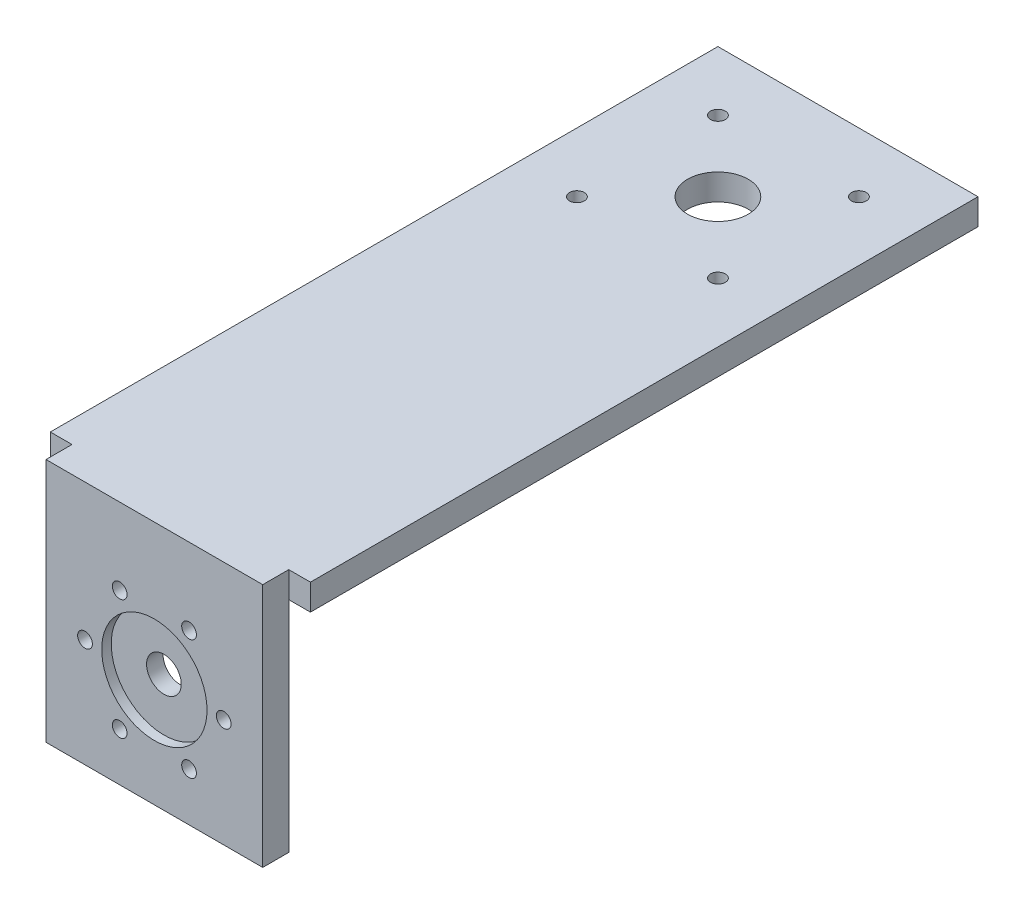
ISO-10303-21;
HEADER;
FILE_DESCRIPTION(('STEP AP214'),'2;1');
FILE_NAME('part.step','',(''),(''),'','','');
FILE_SCHEMA(('AUTOMOTIVE_DESIGN { 1 0 10303 214 1 1 1 1 }'));
ENDSEC;
DATA;
#1=APPLICATION_CONTEXT('core data for automotive mechanical design processes');
#2=APPLICATION_PROTOCOL_DEFINITION('international standard','automotive_design',2000,#1);
#3=PRODUCT_CONTEXT('',#1,'mechanical');
#4=PRODUCT('Part','Part','',(#3));
#5=PRODUCT_RELATED_PRODUCT_CATEGORY('part','',(#4));
#6=PRODUCT_DEFINITION_FORMATION('','',#4);
#7=PRODUCT_DEFINITION_CONTEXT('part definition',#1,'design');
#8=PRODUCT_DEFINITION('design','',#6,#7);
#9=PRODUCT_DEFINITION_SHAPE('','',#8);
#10=(LENGTH_UNIT() NAMED_UNIT(*) SI_UNIT(.MILLI.,.METRE.));
#11=(NAMED_UNIT(*) PLANE_ANGLE_UNIT() SI_UNIT($,.RADIAN.));
#12=(NAMED_UNIT(*) SI_UNIT($,.STERADIAN.) SOLID_ANGLE_UNIT());
#13=UNCERTAINTY_MEASURE_WITH_UNIT(LENGTH_MEASURE(1.E-05),#10,'distance_accuracy_value','');
#14=(GEOMETRIC_REPRESENTATION_CONTEXT(3) GLOBAL_UNCERTAINTY_ASSIGNED_CONTEXT((#13)) GLOBAL_UNIT_ASSIGNED_CONTEXT((#10,
#11,#12)) REPRESENTATION_CONTEXT('',''));
#15=CARTESIAN_POINT('',(0.,0.,0.));
#16=DIRECTION('',(0.,0.,1.));
#17=DIRECTION('',(1.,0.,0.));
#18=AXIS2_PLACEMENT_3D('',#15,#16,#17);
#19=CARTESIAN_POINT('',(0.,0.,-6.));
#20=DIRECTION('',(0.,0.,-1.));
#21=DIRECTION('',(-1.,0.,0.));
#22=AXIS2_PLACEMENT_3D('',#19,#20,#21);
#23=PLANE('',#22);
#24=CARTESIAN_POINT('',(8.,13.856406460551,-6.));
#25=DIRECTION('',(0.,0.,1.));
#26=DIRECTION('',(1.,0.,0.));
#27=AXIS2_PLACEMENT_3D('',#24,#25,#26);
#28=CIRCLE('',#27,1.7);
#29=CARTESIAN_POINT('',(9.7,13.856406460551,-6.));
#30=VERTEX_POINT('',#29);
#31=EDGE_CURVE('E167',#30,#30,#28,.T.);
#32=ORIENTED_EDGE('',*,*,#31,.T.);
#33=EDGE_LOOP('',(#32));
#34=FACE_BOUND('',#33,.T.);
#35=CARTESIAN_POINT('',(-16.,0.,-6.));
#36=DIRECTION('',(0.,0.,1.));
#37=DIRECTION('',(1.,0.,0.));
#38=AXIS2_PLACEMENT_3D('',#35,#36,#37);
#39=CIRCLE('',#38,1.7);
#40=CARTESIAN_POINT('',(-14.3,0.,-6.));
#41=VERTEX_POINT('',#40);
#42=EDGE_CURVE('E177',#41,#41,#39,.T.);
#43=ORIENTED_EDGE('',*,*,#42,.T.);
#44=EDGE_LOOP('',(#43));
#45=FACE_BOUND('',#44,.T.);
#46=CARTESIAN_POINT('',(8.,-13.856406460551,-6.));
#47=DIRECTION('',(0.,0.,1.));
#48=DIRECTION('',(1.,0.,0.));
#49=AXIS2_PLACEMENT_3D('',#46,#47,#48);
#50=CIRCLE('',#49,1.7);
#51=CARTESIAN_POINT('',(9.7,-13.856406460551,-6.));
#52=VERTEX_POINT('',#51);
#53=EDGE_CURVE('E190',#52,#52,#50,.T.);
#54=ORIENTED_EDGE('',*,*,#53,.T.);
#55=EDGE_LOOP('',(#54));
#56=FACE_BOUND('',#55,.T.);
#57=CARTESIAN_POINT('',(16.,0.,-6.));
#58=DIRECTION('',(0.,0.,1.));
#59=DIRECTION('',(1.,0.,0.));
#60=AXIS2_PLACEMENT_3D('',#57,#58,#59);
#61=CIRCLE('',#60,1.7);
#62=CARTESIAN_POINT('',(17.7,0.,-6.));
#63=VERTEX_POINT('',#62);
#64=EDGE_CURVE('E191',#63,#63,#61,.T.);
#65=ORIENTED_EDGE('',*,*,#64,.T.);
#66=EDGE_LOOP('',(#65));
#67=FACE_BOUND('',#66,.T.);
#68=CARTESIAN_POINT('',(-8.,-13.856406460551,-6.));
#69=DIRECTION('',(0.,0.,1.));
#70=DIRECTION('',(1.,0.,0.));
#71=AXIS2_PLACEMENT_3D('',#68,#69,#70);
#72=CIRCLE('',#71,1.7);
#73=CARTESIAN_POINT('',(-6.3,-13.856406460551,-6.));
#74=VERTEX_POINT('',#73);
#75=EDGE_CURVE('E185',#74,#74,#72,.T.);
#76=ORIENTED_EDGE('',*,*,#75,.T.);
#77=EDGE_LOOP('',(#76));
#78=FACE_BOUND('',#77,.T.);
#79=CARTESIAN_POINT('',(-8.00000000000001,13.856406460551,-6.));
#80=DIRECTION('',(0.,0.,1.));
#81=DIRECTION('',(1.,0.,0.));
#82=AXIS2_PLACEMENT_3D('',#79,#80,#81);
#83=CIRCLE('',#82,1.7);
#84=CARTESIAN_POINT('',(-6.30000000000001,13.856406460551,-6.));
#85=VERTEX_POINT('',#84);
#86=EDGE_CURVE('E168',#85,#85,#83,.T.);
#87=ORIENTED_EDGE('',*,*,#86,.T.);
#88=EDGE_LOOP('',(#87));
#89=FACE_BOUND('',#88,.T.);
#90=CARTESIAN_POINT('',(0.,0.,-6.));
#91=DIRECTION('',(0.,0.,1.));
#92=DIRECTION('',(1.,0.,0.));
#93=AXIS2_PLACEMENT_3D('',#90,#91,#92);
#94=CIRCLE('',#93,4.);
#95=CARTESIAN_POINT('',(4.,0.,-6.));
#96=VERTEX_POINT('',#95);
#97=EDGE_CURVE('E162',#96,#96,#94,.T.);
#98=ORIENTED_EDGE('',*,*,#97,.T.);
#99=EDGE_LOOP('',(#98));
#100=FACE_BOUND('',#99,.T.);
#101=DIRECTION('',(0.,-1.,0.));
#102=VECTOR('',#101,1.);
#103=CARTESIAN_POINT('',(-25.,-25.,-6.));
#104=LINE('',#103,#102);
#105=CARTESIAN_POINT('',(-25.,25.5,-6.));
#106=VERTEX_POINT('',#105);
#107=CARTESIAN_POINT('',(-25.,-25.,-6.));
#108=VERTEX_POINT('',#107);
#109=EDGE_CURVE('E199',#106,#108,#104,.T.);
#110=ORIENTED_EDGE('',*,*,#109,.F.);
#111=DIRECTION('',(1.,0.,0.));
#112=VECTOR('',#111,1.);
#113=CARTESIAN_POINT('',(-30.,25.5,-6.));
#114=LINE('',#113,#112);
#115=CARTESIAN_POINT('',(25.,25.5,-6.));
#116=VERTEX_POINT('',#115);
#117=EDGE_CURVE('E11',#106,#116,#114,.T.);
#118=ORIENTED_EDGE('',*,*,#117,.T.);
#119=DIRECTION('',(0.,1.,0.));
#120=VECTOR('',#119,1.);
#121=CARTESIAN_POINT('',(25.,31.5,-6.));
#122=LINE('',#121,#120);
#123=CARTESIAN_POINT('',(25.,-25.,-6.));
#124=VERTEX_POINT('',#123);
#125=EDGE_CURVE('E202',#124,#116,#122,.T.);
#126=ORIENTED_EDGE('',*,*,#125,.F.);
#127=DIRECTION('',(1.,0.,0.));
#128=VECTOR('',#127,1.);
#129=CARTESIAN_POINT('',(25.,-25.,-6.));
#130=LINE('',#129,#128);
#131=EDGE_CURVE('E85',#108,#124,#130,.T.);
#132=ORIENTED_EDGE('',*,*,#131,.F.);
#133=EDGE_LOOP('',(#110,#118,#126,#132));
#134=FACE_BOUND('',#133,.T.);
#135=ADVANCED_FACE('F39',(#34,#45,#56,#67,#78,#89,#100,#134),#23,.T.);
#136=CARTESIAN_POINT('',(0.,0.,0.));
#137=DIRECTION('',(0.,0.,-1.));
#138=DIRECTION('',(-1.,0.,0.));
#139=AXIS2_PLACEMENT_3D('',#136,#137,#138);
#140=CYLINDRICAL_SURFACE('',#139,4.);
#141=ORIENTED_EDGE('',*,*,#97,.F.);
#142=EDGE_LOOP('',(#141));
#143=FACE_BOUND('',#142,.T.);
#144=CARTESIAN_POINT('',(0.,0.,-2.2));
#145=DIRECTION('',(0.,0.,1.));
#146=DIRECTION('',(1.,0.,0.));
#147=AXIS2_PLACEMENT_3D('',#144,#145,#146);
#148=CIRCLE('',#147,4.);
#149=CARTESIAN_POINT('',(4.,0.,-2.2));
#150=VERTEX_POINT('',#149);
#151=EDGE_CURVE('E43',#150,#150,#148,.T.);
#152=ORIENTED_EDGE('',*,*,#151,.T.);
#153=EDGE_LOOP('',(#152));
#154=FACE_BOUND('',#153,.T.);
#155=ADVANCED_FACE('F233',(#143,#154),#140,.F.);
#156=CARTESIAN_POINT('',(0.,0.,0.));
#157=DIRECTION('',(0.,0.,-1.));
#158=DIRECTION('',(-1.,0.,0.));
#159=AXIS2_PLACEMENT_3D('',#156,#157,#158);
#160=PLANE('',#159);
#161=CARTESIAN_POINT('',(0.,0.,0.));
#162=DIRECTION('',(0.,0.,1.));
#163=DIRECTION('',(1.,0.,0.));
#164=AXIS2_PLACEMENT_3D('',#161,#162,#163);
#165=CIRCLE('',#164,12.15);
#166=CARTESIAN_POINT('',(12.15,0.,0.));
#167=VERTEX_POINT('',#166);
#168=EDGE_CURVE('E147',#167,#167,#165,.T.);
#169=ORIENTED_EDGE('',*,*,#168,.F.);
#170=EDGE_LOOP('',(#169));
#171=FACE_BOUND('',#170,.T.);
#172=DIRECTION('',(0.,-1.,0.));
#173=VECTOR('',#172,1.);
#174=CARTESIAN_POINT('',(-25.,-25.,0.));
#175=LINE('',#174,#173);
#176=CARTESIAN_POINT('',(-25.,31.5,0.));
#177=VERTEX_POINT('',#176);
#178=CARTESIAN_POINT('',(-25.,-25.,0.));
#179=VERTEX_POINT('',#178);
#180=EDGE_CURVE('E201',#177,#179,#175,.T.);
#181=ORIENTED_EDGE('',*,*,#180,.T.);
#182=DIRECTION('',(1.,0.,0.));
#183=VECTOR('',#182,1.);
#184=CARTESIAN_POINT('',(25.,-25.,0.));
#185=LINE('',#184,#183);
#186=CARTESIAN_POINT('',(25.,-25.,0.));
#187=VERTEX_POINT('',#186);
#188=EDGE_CURVE('E87',#179,#187,#185,.T.);
#189=ORIENTED_EDGE('',*,*,#188,.T.);
#190=DIRECTION('',(0.,1.,0.));
#191=VECTOR('',#190,1.);
#192=CARTESIAN_POINT('',(25.,31.5,0.));
#193=LINE('',#192,#191);
#194=CARTESIAN_POINT('',(25.,31.5,0.));
#195=VERTEX_POINT('',#194);
#196=EDGE_CURVE('E210',#187,#195,#193,.T.);
#197=ORIENTED_EDGE('',*,*,#196,.T.);
#198=DIRECTION('',(-1.,0.,0.));
#199=VECTOR('',#198,1.);
#200=CARTESIAN_POINT('',(-25.,31.5,0.));
#201=LINE('',#200,#199);
#202=EDGE_CURVE('E67',#195,#177,#201,.T.);
#203=ORIENTED_EDGE('',*,*,#202,.T.);
#204=EDGE_LOOP('',(#181,#189,#197,#203));
#205=FACE_BOUND('',#204,.T.);
#206=CARTESIAN_POINT('',(16.,0.,0.));
#207=DIRECTION('',(0.,0.,1.));
#208=DIRECTION('',(1.,0.,0.));
#209=AXIS2_PLACEMENT_3D('',#206,#207,#208);
#210=CIRCLE('',#209,1.7);
#211=CARTESIAN_POINT('',(17.7,0.,0.));
#212=VERTEX_POINT('',#211);
#213=EDGE_CURVE('E197',#212,#212,#210,.T.);
#214=ORIENTED_EDGE('',*,*,#213,.F.);
#215=EDGE_LOOP('',(#214));
#216=FACE_BOUND('',#215,.T.);
#217=CARTESIAN_POINT('',(8.,-13.856406460551,0.));
#218=DIRECTION('',(0.,0.,1.));
#219=DIRECTION('',(1.,0.,0.));
#220=AXIS2_PLACEMENT_3D('',#217,#218,#219);
#221=CIRCLE('',#220,1.7);
#222=CARTESIAN_POINT('',(9.7,-13.856406460551,0.));
#223=VERTEX_POINT('',#222);
#224=EDGE_CURVE('E192',#223,#223,#221,.T.);
#225=ORIENTED_EDGE('',*,*,#224,.F.);
#226=EDGE_LOOP('',(#225));
#227=FACE_BOUND('',#226,.T.);
#228=CARTESIAN_POINT('',(-8.,-13.856406460551,0.));
#229=DIRECTION('',(0.,0.,1.));
#230=DIRECTION('',(1.,0.,0.));
#231=AXIS2_PLACEMENT_3D('',#228,#229,#230);
#232=CIRCLE('',#231,1.7);
#233=CARTESIAN_POINT('',(-6.3,-13.856406460551,0.));
#234=VERTEX_POINT('',#233);
#235=EDGE_CURVE('E183',#234,#234,#232,.T.);
#236=ORIENTED_EDGE('',*,*,#235,.F.);
#237=EDGE_LOOP('',(#236));
#238=FACE_BOUND('',#237,.T.);
#239=CARTESIAN_POINT('',(-16.,0.,0.));
#240=DIRECTION('',(0.,0.,1.));
#241=DIRECTION('',(1.,0.,0.));
#242=AXIS2_PLACEMENT_3D('',#239,#240,#241);
#243=CIRCLE('',#242,1.7);
#244=CARTESIAN_POINT('',(-14.3,0.,0.));
#245=VERTEX_POINT('',#244);
#246=EDGE_CURVE('E176',#245,#245,#243,.T.);
#247=ORIENTED_EDGE('',*,*,#246,.F.);
#248=EDGE_LOOP('',(#247));
#249=FACE_BOUND('',#248,.T.);
#250=CARTESIAN_POINT('',(-8.00000000000001,13.856406460551,0.));
#251=DIRECTION('',(0.,0.,1.));
#252=DIRECTION('',(1.,0.,0.));
#253=AXIS2_PLACEMENT_3D('',#250,#251,#252);
#254=CIRCLE('',#253,1.7);
#255=CARTESIAN_POINT('',(-6.30000000000001,13.856406460551,0.));
#256=VERTEX_POINT('',#255);
#257=EDGE_CURVE('E175',#256,#256,#254,.T.);
#258=ORIENTED_EDGE('',*,*,#257,.F.);
#259=EDGE_LOOP('',(#258));
#260=FACE_BOUND('',#259,.T.);
#261=CARTESIAN_POINT('',(8.,13.856406460551,0.));
#262=DIRECTION('',(0.,0.,1.));
#263=DIRECTION('',(1.,0.,0.));
#264=AXIS2_PLACEMENT_3D('',#261,#262,#263);
#265=CIRCLE('',#264,1.7);
#266=CARTESIAN_POINT('',(9.7,13.856406460551,0.));
#267=VERTEX_POINT('',#266);
#268=EDGE_CURVE('E170',#267,#267,#265,.T.);
#269=ORIENTED_EDGE('',*,*,#268,.F.);
#270=EDGE_LOOP('',(#269));
#271=FACE_BOUND('',#270,.T.);
#272=ADVANCED_FACE('F235',(#171,#205,#216,#227,#238,#249,#260,#271),#160,.F.);
#273=CARTESIAN_POINT('',(-25.,-25.,0.));
#274=DIRECTION('',(1.,0.,0.));
#275=DIRECTION('',(0.,0.,-1.));
#276=AXIS2_PLACEMENT_3D('',#273,#274,#275);
#277=PLANE('',#276);
#278=CARTESIAN_POINT('',(-25.,31.5,-6.));
#279=VERTEX_POINT('',#278);
#280=EDGE_CURVE('E129',#279,#106,#104,.T.);
#281=ORIENTED_EDGE('',*,*,#280,.T.);
#282=ORIENTED_EDGE('',*,*,#109,.T.);
#283=DIRECTION('',(0.,0.,-1.));
#284=VECTOR('',#283,1.);
#285=CARTESIAN_POINT('',(-25.,-25.,0.));
#286=LINE('',#285,#284);
#287=EDGE_CURVE('E48',#179,#108,#286,.T.);
#288=ORIENTED_EDGE('',*,*,#287,.F.);
#289=ORIENTED_EDGE('',*,*,#180,.F.);
#290=DIRECTION('',(0.,0.,-1.));
#291=VECTOR('',#290,1.);
#292=CARTESIAN_POINT('',(-25.,31.5,0.));
#293=LINE('',#292,#291);
#294=EDGE_CURVE('E209',#177,#279,#293,.T.);
#295=ORIENTED_EDGE('',*,*,#294,.T.);
#296=EDGE_LOOP('',(#281,#282,#288,#289,#295));
#297=FACE_BOUND('',#296,.T.);
#298=ADVANCED_FACE('F41',(#297),#277,.F.);
#299=CARTESIAN_POINT('',(25.,-25.,0.));
#300=DIRECTION('',(0.,1.,0.));
#301=DIRECTION('',(0.,0.,1.));
#302=AXIS2_PLACEMENT_3D('',#299,#300,#301);
#303=PLANE('',#302);
#304=ORIENTED_EDGE('',*,*,#131,.T.);
#305=DIRECTION('',(0.,0.,-1.));
#306=VECTOR('',#305,1.);
#307=CARTESIAN_POINT('',(25.,-25.,0.));
#308=LINE('',#307,#306);
#309=EDGE_CURVE('E218',#187,#124,#308,.T.);
#310=ORIENTED_EDGE('',*,*,#309,.F.);
#311=ORIENTED_EDGE('',*,*,#188,.F.);
#312=ORIENTED_EDGE('',*,*,#287,.T.);
#313=EDGE_LOOP('',(#304,#310,#311,#312));
#314=FACE_BOUND('',#313,.T.);
#315=ADVANCED_FACE('F222',(#314),#303,.F.);
#316=CARTESIAN_POINT('',(25.,31.5,0.));
#317=DIRECTION('',(-1.,0.,0.));
#318=DIRECTION('',(0.,0.,1.));
#319=AXIS2_PLACEMENT_3D('',#316,#317,#318);
#320=PLANE('',#319);
#321=ORIENTED_EDGE('',*,*,#125,.T.);
#322=CARTESIAN_POINT('',(25.,31.5,-6.));
#323=VERTEX_POINT('',#322);
#324=EDGE_CURVE('E213',#116,#323,#122,.T.);
#325=ORIENTED_EDGE('',*,*,#324,.T.);
#326=DIRECTION('',(0.,0.,-1.));
#327=VECTOR('',#326,1.);
#328=CARTESIAN_POINT('',(25.,31.5,0.));
#329=LINE('',#328,#327);
#330=EDGE_CURVE('E220',#195,#323,#329,.T.);
#331=ORIENTED_EDGE('',*,*,#330,.F.);
#332=ORIENTED_EDGE('',*,*,#196,.F.);
#333=ORIENTED_EDGE('',*,*,#309,.T.);
#334=EDGE_LOOP('',(#321,#325,#331,#332,#333));
#335=FACE_BOUND('',#334,.T.);
#336=ADVANCED_FACE('F228',(#335),#320,.F.);
#337=CARTESIAN_POINT('',(-25.,31.5,0.));
#338=DIRECTION('',(0.,-1.,0.));
#339=DIRECTION('',(0.,0.,-1.));
#340=AXIS2_PLACEMENT_3D('',#337,#338,#339);
#341=PLANE('',#340);
#342=ORIENTED_EDGE('',*,*,#330,.T.);
#343=DIRECTION('',(1.,0.,0.));
#344=VECTOR('',#343,1.);
#345=CARTESIAN_POINT('',(-30.,31.5,-6.));
#346=LINE('',#345,#344);
#347=CARTESIAN_POINT('',(30.,31.5,-6.));
#348=VERTEX_POINT('',#347);
#349=EDGE_CURVE('E135',#323,#348,#346,.T.);
#350=ORIENTED_EDGE('',*,*,#349,.T.);
#351=DIRECTION('',(0.,0.,-1.));
#352=VECTOR('',#351,1.);
#353=CARTESIAN_POINT('',(30.,31.5,-6.));
#354=LINE('',#353,#352);
#355=CARTESIAN_POINT('',(30.,31.5,-160.));
#356=VERTEX_POINT('',#355);
#357=EDGE_CURVE('E131',#348,#356,#354,.T.);
#358=ORIENTED_EDGE('',*,*,#357,.T.);
#359=DIRECTION('',(-1.,0.,0.));
#360=VECTOR('',#359,1.);
#361=CARTESIAN_POINT('',(30.,31.5,-160.));
#362=LINE('',#361,#360);
#363=CARTESIAN_POINT('',(-30.,31.5,-160.));
#364=VERTEX_POINT('',#363);
#365=EDGE_CURVE('E143',#356,#364,#362,.T.);
#366=ORIENTED_EDGE('',*,*,#365,.T.);
#367=DIRECTION('',(0.,0.,1.));
#368=VECTOR('',#367,1.);
#369=CARTESIAN_POINT('',(-30.,31.5,-160.));
#370=LINE('',#369,#368);
#371=CARTESIAN_POINT('',(-30.,31.5,-6.));
#372=VERTEX_POINT('',#371);
#373=EDGE_CURVE('E137',#364,#372,#370,.T.);
#374=ORIENTED_EDGE('',*,*,#373,.T.);
#375=EDGE_CURVE('E122',#372,#279,#346,.T.);
#376=ORIENTED_EDGE('',*,*,#375,.T.);
#377=ORIENTED_EDGE('',*,*,#294,.F.);
#378=ORIENTED_EDGE('',*,*,#202,.F.);
#379=EDGE_LOOP('',(#342,#350,#358,#366,#374,#376,#377,#378));
#380=FACE_BOUND('',#379,.T.);
#381=CARTESIAN_POINT('',(16.2634559672906,31.5,-113.736544032709));
#382=DIRECTION('',(0.,1.,0.));
#383=DIRECTION('',(0.,0.,1.));
#384=AXIS2_PLACEMENT_3D('',#381,#382,#383);
#385=CIRCLE('',#384,1.7);
#386=CARTESIAN_POINT('',(16.2634559672906,31.5,-112.036544032709));
#387=VERTEX_POINT('',#386);
#388=EDGE_CURVE('E524',#387,#387,#385,.T.);
#389=ORIENTED_EDGE('',*,*,#388,.F.);
#390=EDGE_LOOP('',(#389));
#391=FACE_BOUND('',#390,.T.);
#392=CARTESIAN_POINT('',(-16.2634559672906,31.5,-146.263455967291));
#393=DIRECTION('',(0.,1.,0.));
#394=DIRECTION('',(0.,0.,1.));
#395=AXIS2_PLACEMENT_3D('',#392,#393,#394);
#396=CIRCLE('',#395,1.7);
#397=CARTESIAN_POINT('',(-16.2634559672906,31.5,-144.563455967291));
#398=VERTEX_POINT('',#397);
#399=EDGE_CURVE('E532',#398,#398,#396,.T.);
#400=ORIENTED_EDGE('',*,*,#399,.F.);
#401=EDGE_LOOP('',(#400));
#402=FACE_BOUND('',#401,.T.);
#403=CARTESIAN_POINT('',(16.2634559672906,31.5,-146.263455967291));
#404=DIRECTION('',(0.,1.,0.));
#405=DIRECTION('',(0.,0.,1.));
#406=AXIS2_PLACEMENT_3D('',#403,#404,#405);
#407=CIRCLE('',#406,1.7);
#408=CARTESIAN_POINT('',(16.2634559672906,31.5,-144.563455967291));
#409=VERTEX_POINT('',#408);
#410=EDGE_CURVE('E541',#409,#409,#407,.T.);
#411=ORIENTED_EDGE('',*,*,#410,.F.);
#412=EDGE_LOOP('',(#411));
#413=FACE_BOUND('',#412,.T.);
#414=CARTESIAN_POINT('',(-16.2634559672906,31.5,-113.736544032709));
#415=DIRECTION('',(0.,1.,0.));
#416=DIRECTION('',(0.,0.,1.));
#417=AXIS2_PLACEMENT_3D('',#414,#415,#416);
#418=CIRCLE('',#417,1.7);
#419=CARTESIAN_POINT('',(-16.2634559672906,31.5,-112.036544032709));
#420=VERTEX_POINT('',#419);
#421=EDGE_CURVE('E530',#420,#420,#418,.T.);
#422=ORIENTED_EDGE('',*,*,#421,.F.);
#423=EDGE_LOOP('',(#422));
#424=FACE_BOUND('',#423,.T.);
#425=CARTESIAN_POINT('',(0.,31.5,-130.));
#426=DIRECTION('',(0.,1.,0.));
#427=DIRECTION('',(0.,0.,1.));
#428=AXIS2_PLACEMENT_3D('',#425,#426,#427);
#429=CIRCLE('',#428,7.);
#430=CARTESIAN_POINT('',(0.,31.5,-123.));
#431=VERTEX_POINT('',#430);
#432=EDGE_CURVE('E514',#431,#431,#429,.T.);
#433=ORIENTED_EDGE('',*,*,#432,.F.);
#434=EDGE_LOOP('',(#433));
#435=FACE_BOUND('',#434,.T.);
#436=ADVANCED_FACE('F139',(#380,#391,#402,#413,#424,#435),#341,.F.);
#437=CARTESIAN_POINT('',(16.,0.,0.));
#438=DIRECTION('',(0.,0.,-1.));
#439=DIRECTION('',(-1.,0.,0.));
#440=AXIS2_PLACEMENT_3D('',#437,#438,#439);
#441=CYLINDRICAL_SURFACE('',#440,1.7);
#442=ORIENTED_EDGE('',*,*,#213,.T.);
#443=EDGE_LOOP('',(#442));
#444=FACE_BOUND('',#443,.T.);
#445=ORIENTED_EDGE('',*,*,#64,.F.);
#446=EDGE_LOOP('',(#445));
#447=FACE_BOUND('',#446,.T.);
#448=ADVANCED_FACE('F307',(#444,#447),#441,.F.);
#449=CARTESIAN_POINT('',(8.,-13.856406460551,0.));
#450=DIRECTION('',(0.,0.,-1.));
#451=DIRECTION('',(-1.,0.,0.));
#452=AXIS2_PLACEMENT_3D('',#449,#450,#451);
#453=CYLINDRICAL_SURFACE('',#452,1.7);
#454=ORIENTED_EDGE('',*,*,#224,.T.);
#455=EDGE_LOOP('',(#454));
#456=FACE_BOUND('',#455,.T.);
#457=ORIENTED_EDGE('',*,*,#53,.F.);
#458=EDGE_LOOP('',(#457));
#459=FACE_BOUND('',#458,.T.);
#460=ADVANCED_FACE('F304',(#456,#459),#453,.F.);
#461=CARTESIAN_POINT('',(-8.,-13.856406460551,0.));
#462=DIRECTION('',(0.,0.,-1.));
#463=DIRECTION('',(-1.,0.,0.));
#464=AXIS2_PLACEMENT_3D('',#461,#462,#463);
#465=CYLINDRICAL_SURFACE('',#464,1.7);
#466=ORIENTED_EDGE('',*,*,#235,.T.);
#467=EDGE_LOOP('',(#466));
#468=FACE_BOUND('',#467,.T.);
#469=ORIENTED_EDGE('',*,*,#75,.F.);
#470=EDGE_LOOP('',(#469));
#471=FACE_BOUND('',#470,.T.);
#472=ADVANCED_FACE('F298',(#468,#471),#465,.F.);
#473=CARTESIAN_POINT('',(-16.,0.,0.));
#474=DIRECTION('',(0.,0.,-1.));
#475=DIRECTION('',(-1.,0.,0.));
#476=AXIS2_PLACEMENT_3D('',#473,#474,#475);
#477=CYLINDRICAL_SURFACE('',#476,1.7);
#478=ORIENTED_EDGE('',*,*,#246,.T.);
#479=EDGE_LOOP('',(#478));
#480=FACE_BOUND('',#479,.T.);
#481=ORIENTED_EDGE('',*,*,#42,.F.);
#482=EDGE_LOOP('',(#481));
#483=FACE_BOUND('',#482,.T.);
#484=ADVANCED_FACE('F293',(#480,#483),#477,.F.);
#485=CARTESIAN_POINT('',(-8.00000000000001,13.856406460551,0.));
#486=DIRECTION('',(0.,0.,-1.));
#487=DIRECTION('',(-1.,0.,0.));
#488=AXIS2_PLACEMENT_3D('',#485,#486,#487);
#489=CYLINDRICAL_SURFACE('',#488,1.7);
#490=ORIENTED_EDGE('',*,*,#257,.T.);
#491=EDGE_LOOP('',(#490));
#492=FACE_BOUND('',#491,.T.);
#493=ORIENTED_EDGE('',*,*,#86,.F.);
#494=EDGE_LOOP('',(#493));
#495=FACE_BOUND('',#494,.T.);
#496=ADVANCED_FACE('F255',(#492,#495),#489,.F.);
#497=CARTESIAN_POINT('',(8.,13.856406460551,0.));
#498=DIRECTION('',(0.,0.,-1.));
#499=DIRECTION('',(-1.,0.,0.));
#500=AXIS2_PLACEMENT_3D('',#497,#498,#499);
#501=CYLINDRICAL_SURFACE('',#500,1.7);
#502=ORIENTED_EDGE('',*,*,#268,.T.);
#503=EDGE_LOOP('',(#502));
#504=FACE_BOUND('',#503,.T.);
#505=ORIENTED_EDGE('',*,*,#31,.F.);
#506=EDGE_LOOP('',(#505));
#507=FACE_BOUND('',#506,.T.);
#508=ADVANCED_FACE('F248',(#504,#507),#501,.F.);
#509=CARTESIAN_POINT('',(0.,0.,-2.2));
#510=DIRECTION('',(0.,0.,1.));
#511=DIRECTION('',(1.,0.,0.));
#512=AXIS2_PLACEMENT_3D('',#509,#510,#511);
#513=CYLINDRICAL_SURFACE('',#512,12.15);
#514=CARTESIAN_POINT('',(0.,0.,-2.2));
#515=DIRECTION('',(0.,0.,1.));
#516=DIRECTION('',(1.,0.,0.));
#517=AXIS2_PLACEMENT_3D('',#514,#515,#516);
#518=CIRCLE('',#517,12.15);
#519=CARTESIAN_POINT('',(12.15,0.,-2.2));
#520=VERTEX_POINT('',#519);
#521=EDGE_CURVE('E152',#520,#520,#518,.T.);
#522=ORIENTED_EDGE('',*,*,#521,.F.);
#523=EDGE_LOOP('',(#522));
#524=FACE_BOUND('',#523,.T.);
#525=ORIENTED_EDGE('',*,*,#168,.T.);
#526=EDGE_LOOP('',(#525));
#527=FACE_BOUND('',#526,.T.);
#528=ADVANCED_FACE('F251',(#524,#527),#513,.F.);
#529=CARTESIAN_POINT('',(0.,0.,-2.2));
#530=DIRECTION('',(0.,0.,1.));
#531=DIRECTION('',(1.,0.,0.));
#532=AXIS2_PLACEMENT_3D('',#529,#530,#531);
#533=PLANE('',#532);
#534=ORIENTED_EDGE('',*,*,#151,.F.);
#535=EDGE_LOOP('',(#534));
#536=FACE_BOUND('',#535,.T.);
#537=ORIENTED_EDGE('',*,*,#521,.T.);
#538=EDGE_LOOP('',(#537));
#539=FACE_BOUND('',#538,.T.);
#540=ADVANCED_FACE('F276',(#536,#539),#533,.T.);
#541=CARTESIAN_POINT('',(-30.,31.5,-6.));
#542=DIRECTION('',(0.,0.,-1.));
#543=DIRECTION('',(-1.,0.,0.));
#544=AXIS2_PLACEMENT_3D('',#541,#542,#543);
#545=PLANE('',#544);
#546=ORIENTED_EDGE('',*,*,#280,.F.);
#547=ORIENTED_EDGE('',*,*,#375,.F.);
#548=DIRECTION('',(0.,-1.,0.));
#549=VECTOR('',#548,1.);
#550=CARTESIAN_POINT('',(-30.,31.5,-6.));
#551=LINE('',#550,#549);
#552=CARTESIAN_POINT('',(-30.,25.5,-6.));
#553=VERTEX_POINT('',#552);
#554=EDGE_CURVE('E127',#372,#553,#551,.T.);
#555=ORIENTED_EDGE('',*,*,#554,.T.);
#556=EDGE_CURVE('E49',#553,#106,#114,.T.);
#557=ORIENTED_EDGE('',*,*,#556,.T.);
#558=EDGE_LOOP('',(#546,#547,#555,#557));
#559=FACE_BOUND('',#558,.T.);
#560=ADVANCED_FACE('F124',(#559),#545,.F.);
#561=CARTESIAN_POINT('',(0.,25.5,0.));
#562=DIRECTION('',(0.,1.,0.));
#563=DIRECTION('',(0.,0.,1.));
#564=AXIS2_PLACEMENT_3D('',#561,#562,#563);
#565=PLANE('',#564);
#566=DIRECTION('',(0.,0.,1.));
#567=VECTOR('',#566,1.);
#568=CARTESIAN_POINT('',(-30.,25.5,-160.));
#569=LINE('',#568,#567);
#570=CARTESIAN_POINT('',(-30.,25.5,-160.));
#571=VERTEX_POINT('',#570);
#572=EDGE_CURVE('E149',#571,#553,#569,.T.);
#573=ORIENTED_EDGE('',*,*,#572,.F.);
#574=DIRECTION('',(-1.,0.,0.));
#575=VECTOR('',#574,1.);
#576=CARTESIAN_POINT('',(30.,25.5,-160.));
#577=LINE('',#576,#575);
#578=CARTESIAN_POINT('',(30.,25.5,-160.));
#579=VERTEX_POINT('',#578);
#580=EDGE_CURVE('E144',#579,#571,#577,.T.);
#581=ORIENTED_EDGE('',*,*,#580,.F.);
#582=DIRECTION('',(0.,0.,-1.));
#583=VECTOR('',#582,1.);
#584=CARTESIAN_POINT('',(30.,25.5,-6.));
#585=LINE('',#584,#583);
#586=CARTESIAN_POINT('',(30.,25.5,-6.));
#587=VERTEX_POINT('',#586);
#588=EDGE_CURVE('E549',#587,#579,#585,.T.);
#589=ORIENTED_EDGE('',*,*,#588,.F.);
#590=EDGE_CURVE('E51',#116,#587,#114,.T.);
#591=ORIENTED_EDGE('',*,*,#590,.F.);
#592=ORIENTED_EDGE('',*,*,#117,.F.);
#593=ORIENTED_EDGE('',*,*,#556,.F.);
#594=EDGE_LOOP('',(#573,#581,#589,#591,#592,#593));
#595=FACE_BOUND('',#594,.T.);
#596=CARTESIAN_POINT('',(16.2634559672906,25.5,-146.263455967291));
#597=DIRECTION('',(0.,1.,0.));
#598=DIRECTION('',(0.,0.,1.));
#599=AXIS2_PLACEMENT_3D('',#596,#597,#598);
#600=CIRCLE('',#599,1.7);
#601=CARTESIAN_POINT('',(16.2634559672906,25.5,-144.563455967291));
#602=VERTEX_POINT('',#601);
#603=EDGE_CURVE('E538',#602,#602,#600,.T.);
#604=ORIENTED_EDGE('',*,*,#603,.T.);
#605=EDGE_LOOP('',(#604));
#606=FACE_BOUND('',#605,.T.);
#607=CARTESIAN_POINT('',(-16.2634559672906,25.5,-146.263455967291));
#608=DIRECTION('',(0.,1.,0.));
#609=DIRECTION('',(0.,0.,1.));
#610=AXIS2_PLACEMENT_3D('',#607,#608,#609);
#611=CIRCLE('',#610,1.7);
#612=CARTESIAN_POINT('',(-16.2634559672906,25.5,-144.563455967291));
#613=VERTEX_POINT('',#612);
#614=EDGE_CURVE('E535',#613,#613,#611,.T.);
#615=ORIENTED_EDGE('',*,*,#614,.T.);
#616=EDGE_LOOP('',(#615));
#617=FACE_BOUND('',#616,.T.);
#618=CARTESIAN_POINT('',(-16.2634559672906,25.5,-113.736544032709));
#619=DIRECTION('',(0.,1.,0.));
#620=DIRECTION('',(0.,0.,1.));
#621=AXIS2_PLACEMENT_3D('',#618,#619,#620);
#622=CIRCLE('',#621,1.7);
#623=CARTESIAN_POINT('',(-16.2634559672906,25.5,-112.036544032709));
#624=VERTEX_POINT('',#623);
#625=EDGE_CURVE('E528',#624,#624,#622,.T.);
#626=ORIENTED_EDGE('',*,*,#625,.T.);
#627=EDGE_LOOP('',(#626));
#628=FACE_BOUND('',#627,.T.);
#629=CARTESIAN_POINT('',(16.2634559672906,25.5,-113.736544032709));
#630=DIRECTION('',(0.,1.,0.));
#631=DIRECTION('',(0.,0.,1.));
#632=AXIS2_PLACEMENT_3D('',#629,#630,#631);
#633=CIRCLE('',#632,1.7);
#634=CARTESIAN_POINT('',(16.2634559672906,25.5,-112.036544032709));
#635=VERTEX_POINT('',#634);
#636=EDGE_CURVE('E517',#635,#635,#633,.T.);
#637=ORIENTED_EDGE('',*,*,#636,.T.);
#638=EDGE_LOOP('',(#637));
#639=FACE_BOUND('',#638,.T.);
#640=CARTESIAN_POINT('',(0.,25.5,-130.));
#641=DIRECTION('',(0.,1.,0.));
#642=DIRECTION('',(0.,0.,1.));
#643=AXIS2_PLACEMENT_3D('',#640,#641,#642);
#644=CIRCLE('',#643,7.);
#645=CARTESIAN_POINT('',(0.,25.5,-123.));
#646=VERTEX_POINT('',#645);
#647=EDGE_CURVE('E516',#646,#646,#644,.T.);
#648=ORIENTED_EDGE('',*,*,#647,.T.);
#649=EDGE_LOOP('',(#648));
#650=FACE_BOUND('',#649,.T.);
#651=ADVANCED_FACE('F345',(#595,#606,#617,#628,#639,#650),#565,.F.);
#652=CARTESIAN_POINT('',(-30.,31.5,-160.));
#653=DIRECTION('',(1.,0.,0.));
#654=DIRECTION('',(0.,0.,-1.));
#655=AXIS2_PLACEMENT_3D('',#652,#653,#654);
#656=PLANE('',#655);
#657=ORIENTED_EDGE('',*,*,#572,.T.);
#658=ORIENTED_EDGE('',*,*,#554,.F.);
#659=ORIENTED_EDGE('',*,*,#373,.F.);
#660=DIRECTION('',(0.,-1.,0.));
#661=VECTOR('',#660,1.);
#662=CARTESIAN_POINT('',(-30.,31.5,-160.));
#663=LINE('',#662,#661);
#664=EDGE_CURVE('E547',#364,#571,#663,.T.);
#665=ORIENTED_EDGE('',*,*,#664,.T.);
#666=EDGE_LOOP('',(#657,#658,#659,#665));
#667=FACE_BOUND('',#666,.T.);
#668=ADVANCED_FACE('F150',(#667),#656,.F.);
#669=ORIENTED_EDGE('',*,*,#324,.F.);
#670=ORIENTED_EDGE('',*,*,#590,.T.);
#671=DIRECTION('',(0.,-1.,0.));
#672=VECTOR('',#671,1.);
#673=CARTESIAN_POINT('',(30.,31.5,-6.));
#674=LINE('',#673,#672);
#675=EDGE_CURVE('E151',#348,#587,#674,.T.);
#676=ORIENTED_EDGE('',*,*,#675,.F.);
#677=ORIENTED_EDGE('',*,*,#349,.F.);
#678=EDGE_LOOP('',(#669,#670,#676,#677));
#679=FACE_BOUND('',#678,.T.);
#680=ADVANCED_FACE('F341',(#679),#545,.F.);
#681=CARTESIAN_POINT('',(30.,31.5,-6.));
#682=DIRECTION('',(-1.,0.,0.));
#683=DIRECTION('',(0.,0.,1.));
#684=AXIS2_PLACEMENT_3D('',#681,#682,#683);
#685=PLANE('',#684);
#686=ORIENTED_EDGE('',*,*,#588,.T.);
#687=DIRECTION('',(0.,-1.,0.));
#688=VECTOR('',#687,1.);
#689=CARTESIAN_POINT('',(30.,31.5,-160.));
#690=LINE('',#689,#688);
#691=EDGE_CURVE('E160',#356,#579,#690,.T.);
#692=ORIENTED_EDGE('',*,*,#691,.F.);
#693=ORIENTED_EDGE('',*,*,#357,.F.);
#694=ORIENTED_EDGE('',*,*,#675,.T.);
#695=EDGE_LOOP('',(#686,#692,#693,#694));
#696=FACE_BOUND('',#695,.T.);
#697=ADVANCED_FACE('F365',(#696),#685,.F.);
#698=CARTESIAN_POINT('',(30.,31.5,-160.));
#699=DIRECTION('',(0.,0.,1.));
#700=DIRECTION('',(1.,0.,0.));
#701=AXIS2_PLACEMENT_3D('',#698,#699,#700);
#702=PLANE('',#701);
#703=ORIENTED_EDGE('',*,*,#580,.T.);
#704=ORIENTED_EDGE('',*,*,#664,.F.);
#705=ORIENTED_EDGE('',*,*,#365,.F.);
#706=ORIENTED_EDGE('',*,*,#691,.T.);
#707=EDGE_LOOP('',(#703,#704,#705,#706));
#708=FACE_BOUND('',#707,.T.);
#709=ADVANCED_FACE('F375',(#708),#702,.F.);
#710=CARTESIAN_POINT('',(16.2634559672906,31.5,-146.263455967291));
#711=DIRECTION('',(0.,-1.,0.));
#712=DIRECTION('',(0.,0.,-1.));
#713=AXIS2_PLACEMENT_3D('',#710,#711,#712);
#714=CYLINDRICAL_SURFACE('',#713,1.7);
#715=ORIENTED_EDGE('',*,*,#410,.T.);
#716=EDGE_LOOP('',(#715));
#717=FACE_BOUND('',#716,.T.);
#718=ORIENTED_EDGE('',*,*,#603,.F.);
#719=EDGE_LOOP('',(#718));
#720=FACE_BOUND('',#719,.T.);
#721=ADVANCED_FACE('F381',(#717,#720),#714,.F.);
#722=CARTESIAN_POINT('',(-16.2634559672906,31.5,-146.263455967291));
#723=DIRECTION('',(0.,-1.,0.));
#724=DIRECTION('',(0.,0.,-1.));
#725=AXIS2_PLACEMENT_3D('',#722,#723,#724);
#726=CYLINDRICAL_SURFACE('',#725,1.7);
#727=ORIENTED_EDGE('',*,*,#399,.T.);
#728=EDGE_LOOP('',(#727));
#729=FACE_BOUND('',#728,.T.);
#730=ORIENTED_EDGE('',*,*,#614,.F.);
#731=EDGE_LOOP('',(#730));
#732=FACE_BOUND('',#731,.T.);
#733=ADVANCED_FACE('F388',(#729,#732),#726,.F.);
#734=CARTESIAN_POINT('',(-16.2634559672906,31.5,-113.736544032709));
#735=DIRECTION('',(0.,-1.,0.));
#736=DIRECTION('',(0.,0.,-1.));
#737=AXIS2_PLACEMENT_3D('',#734,#735,#736);
#738=CYLINDRICAL_SURFACE('',#737,1.7);
#739=ORIENTED_EDGE('',*,*,#421,.T.);
#740=EDGE_LOOP('',(#739));
#741=FACE_BOUND('',#740,.T.);
#742=ORIENTED_EDGE('',*,*,#625,.F.);
#743=EDGE_LOOP('',(#742));
#744=FACE_BOUND('',#743,.T.);
#745=ADVANCED_FACE('F396',(#741,#744),#738,.F.);
#746=CARTESIAN_POINT('',(16.2634559672906,31.5,-113.736544032709));
#747=DIRECTION('',(0.,-1.,0.));
#748=DIRECTION('',(0.,0.,-1.));
#749=AXIS2_PLACEMENT_3D('',#746,#747,#748);
#750=CYLINDRICAL_SURFACE('',#749,1.7);
#751=ORIENTED_EDGE('',*,*,#388,.T.);
#752=EDGE_LOOP('',(#751));
#753=FACE_BOUND('',#752,.T.);
#754=ORIENTED_EDGE('',*,*,#636,.F.);
#755=EDGE_LOOP('',(#754));
#756=FACE_BOUND('',#755,.T.);
#757=ADVANCED_FACE('F410',(#753,#756),#750,.F.);
#758=CARTESIAN_POINT('',(0.,31.5,-130.));
#759=DIRECTION('',(0.,-1.,0.));
#760=DIRECTION('',(0.,0.,-1.));
#761=AXIS2_PLACEMENT_3D('',#758,#759,#760);
#762=CYLINDRICAL_SURFACE('',#761,7.);
#763=ORIENTED_EDGE('',*,*,#432,.T.);
#764=EDGE_LOOP('',(#763));
#765=FACE_BOUND('',#764,.T.);
#766=ORIENTED_EDGE('',*,*,#647,.F.);
#767=EDGE_LOOP('',(#766));
#768=FACE_BOUND('',#767,.T.);
#769=ADVANCED_FACE('F417',(#765,#768),#762,.F.);
#770=CLOSED_SHELL('',(#135,#155,#272,#298,#315,#336,#436,#448,#460,#472,#484,#496,#508,#528,
#540,#560,#651,#668,#680,#697,#709,#721,#733,#745,#757,#769));
#771=MANIFOLD_SOLID_BREP('B2',#770);
#772=ADVANCED_BREP_SHAPE_REPRESENTATION('',(#18,#771),#14);
#773=SHAPE_DEFINITION_REPRESENTATION(#9,#772);
ENDSEC;
END-ISO-10303-21;
